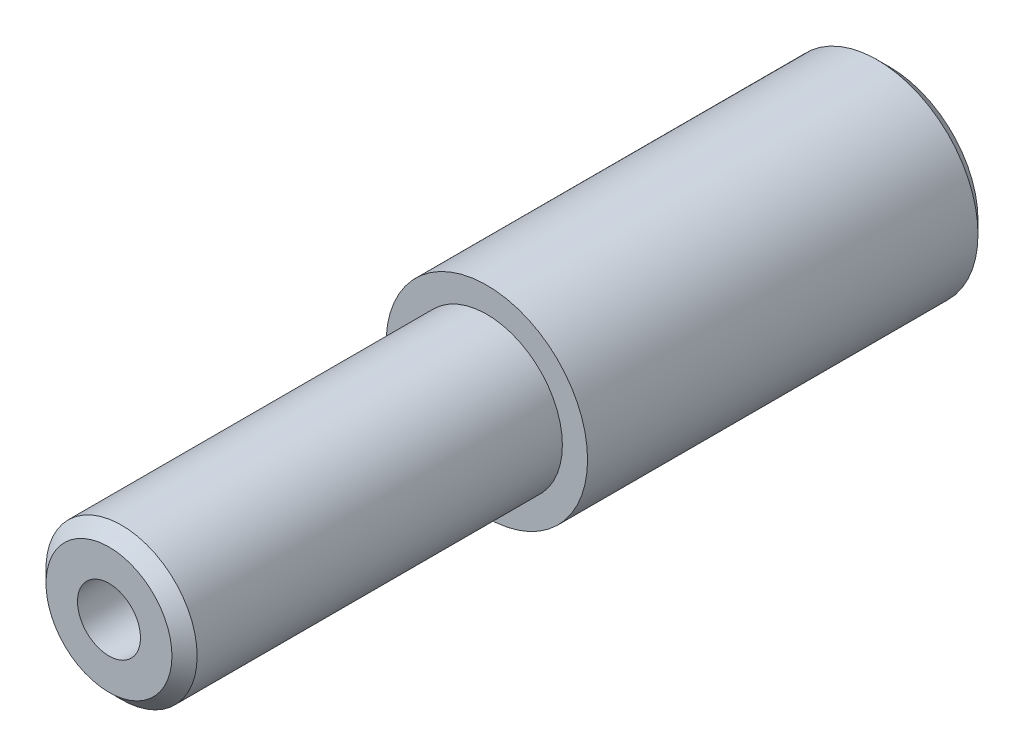
ISO-10303-21;
HEADER;
FILE_DESCRIPTION(('STEP AP214'),'2;1');
FILE_NAME('part.step','',(''),(''),'','','');
FILE_SCHEMA(('AUTOMOTIVE_DESIGN { 1 0 10303 214 1 1 1 1 }'));
ENDSEC;
DATA;
#1=APPLICATION_CONTEXT('core data for automotive mechanical design processes');
#2=APPLICATION_PROTOCOL_DEFINITION('international standard','automotive_design',2000,#1);
#3=PRODUCT_CONTEXT('',#1,'mechanical');
#4=PRODUCT('Part','Part','',(#3));
#5=PRODUCT_RELATED_PRODUCT_CATEGORY('part','',(#4));
#6=PRODUCT_DEFINITION_FORMATION('','',#4);
#7=PRODUCT_DEFINITION_CONTEXT('part definition',#1,'design');
#8=PRODUCT_DEFINITION('design','',#6,#7);
#9=PRODUCT_DEFINITION_SHAPE('','',#8);
#10=(LENGTH_UNIT() NAMED_UNIT(*) SI_UNIT(.MILLI.,.METRE.));
#11=(NAMED_UNIT(*) PLANE_ANGLE_UNIT() SI_UNIT($,.RADIAN.));
#12=(NAMED_UNIT(*) SI_UNIT($,.STERADIAN.) SOLID_ANGLE_UNIT());
#13=UNCERTAINTY_MEASURE_WITH_UNIT(LENGTH_MEASURE(1.E-05),#10,'distance_accuracy_value','');
#14=(GEOMETRIC_REPRESENTATION_CONTEXT(3) GLOBAL_UNCERTAINTY_ASSIGNED_CONTEXT((#13)) GLOBAL_UNIT_ASSIGNED_CONTEXT((#10,
#11,#12)) REPRESENTATION_CONTEXT('',''));
#15=CARTESIAN_POINT('',(0.,0.,0.));
#16=DIRECTION('',(0.,0.,1.));
#17=DIRECTION('',(1.,0.,0.));
#18=AXIS2_PLACEMENT_3D('',#15,#16,#17);
#19=CARTESIAN_POINT('',(-161.229707573776,-61.0733009045741,16.));
#20=DIRECTION('',(0.,0.,1.));
#21=DIRECTION('',(1.,0.,0.));
#22=AXIS2_PLACEMENT_3D('',#19,#20,#21);
#23=PLANE('',#22);
#24=CARTESIAN_POINT('',(-161.229707573776,-61.0733009045741,16.));
#25=DIRECTION('',(0.,0.,1.));
#26=DIRECTION('',(1.,0.,0.));
#27=AXIS2_PLACEMENT_3D('',#24,#25,#26);
#28=CIRCLE('',#27,3.99999999999999);
#29=CARTESIAN_POINT('',(-157.229707573776,-61.0733009045741,16.));
#30=VERTEX_POINT('',#29);
#31=EDGE_CURVE('E54',#30,#30,#28,.T.);
#32=ORIENTED_EDGE('',*,*,#31,.T.);
#33=EDGE_LOOP('',(#32));
#34=FACE_BOUND('',#33,.T.);
#35=CARTESIAN_POINT('',(-161.229707573776,-61.0733009045741,16.));
#36=DIRECTION('',(0.,0.,1.));
#37=DIRECTION('',(1.,0.,0.));
#38=AXIS2_PLACEMENT_3D('',#35,#36,#37);
#39=CIRCLE('',#38,2.99999999999999);
#40=CARTESIAN_POINT('',(-158.229707573776,-61.0733009045741,16.));
#41=VERTEX_POINT('',#40);
#42=EDGE_CURVE('E57',#41,#41,#39,.T.);
#43=ORIENTED_EDGE('',*,*,#42,.F.);
#44=EDGE_LOOP('',(#43));
#45=FACE_BOUND('',#44,.T.);
#46=ADVANCED_FACE('F34',(#34,#45),#23,.T.);
#47=CARTESIAN_POINT('',(-161.229707573776,-61.0733009045741,16.));
#48=DIRECTION('',(0.,0.,-1.));
#49=DIRECTION('',(-1.,0.,0.));
#50=AXIS2_PLACEMENT_3D('',#47,#48,#49);
#51=CYLINDRICAL_SURFACE('',#50,3.99999999999999);
#52=CARTESIAN_POINT('',(-161.229707573776,-61.0733009045741,0.49999999999998));
#53=DIRECTION('',(0.,0.,1.));
#54=DIRECTION('',(1.,0.,0.));
#55=AXIS2_PLACEMENT_3D('',#52,#53,#54);
#56=CIRCLE('',#55,3.99999999999999);
#57=CARTESIAN_POINT('',(-157.229707573776,-61.0733009045741,0.49999999999998));
#58=VERTEX_POINT('',#57);
#59=EDGE_CURVE('E49',#58,#58,#56,.T.);
#60=ORIENTED_EDGE('',*,*,#59,.T.);
#61=EDGE_LOOP('',(#60));
#62=FACE_BOUND('',#61,.T.);
#63=ORIENTED_EDGE('',*,*,#31,.F.);
#64=EDGE_LOOP('',(#63));
#65=FACE_BOUND('',#64,.T.);
#66=ADVANCED_FACE('F83',(#62,#65),#51,.T.);
#67=CARTESIAN_POINT('',(-161.229707573776,-61.0733009045741,0.));
#68=DIRECTION('',(0.,0.,1.));
#69=DIRECTION('',(1.,0.,0.));
#70=AXIS2_PLACEMENT_3D('',#67,#68,#69);
#71=PLANE('',#70);
#72=CARTESIAN_POINT('',(-161.229707573776,-61.0733009045741,0.));
#73=DIRECTION('',(0.,0.,1.));
#74=DIRECTION('',(1.,0.,0.));
#75=AXIS2_PLACEMENT_3D('',#72,#73,#74);
#76=CIRCLE('',#75,3.5);
#77=CARTESIAN_POINT('',(-157.729707573776,-61.0733009045741,0.));
#78=VERTEX_POINT('',#77);
#79=EDGE_CURVE('E45',#78,#78,#76,.F.);
#80=ORIENTED_EDGE('',*,*,#79,.T.);
#81=EDGE_LOOP('',(#80));
#82=FACE_BOUND('',#81,.T.);
#83=CARTESIAN_POINT('',(-161.229707573776,-61.0733009045741,0.));
#84=DIRECTION('',(0.,0.,1.));
#85=DIRECTION('',(1.,0.,0.));
#86=AXIS2_PLACEMENT_3D('',#83,#84,#85);
#87=CIRCLE('',#86,1.25000000000001);
#88=CARTESIAN_POINT('',(-159.979707573776,-61.0733009045741,0.));
#89=VERTEX_POINT('',#88);
#90=EDGE_CURVE('E60',#89,#89,#87,.T.);
#91=ORIENTED_EDGE('',*,*,#90,.T.);
#92=EDGE_LOOP('',(#91));
#93=FACE_BOUND('',#92,.T.);
#94=ADVANCED_FACE('F80',(#82,#93),#71,.F.);
#95=CARTESIAN_POINT('',(-161.229707573776,-61.0733009045741,31.));
#96=DIRECTION('',(0.,0.,-1.));
#97=DIRECTION('',(-1.,0.,0.));
#98=AXIS2_PLACEMENT_3D('',#95,#96,#97);
#99=CYLINDRICAL_SURFACE('',#98,2.99999999999999);
#100=CARTESIAN_POINT('',(-161.229707573776,-61.0733009045741,30.5));
#101=DIRECTION('',(0.,0.,1.));
#102=DIRECTION('',(1.,0.,0.));
#103=AXIS2_PLACEMENT_3D('',#100,#101,#102);
#104=CIRCLE('',#103,2.99999999999999);
#105=CARTESIAN_POINT('',(-158.229707573776,-61.0733009045741,30.5));
#106=VERTEX_POINT('',#105);
#107=EDGE_CURVE('E10',#106,#106,#104,.F.);
#108=ORIENTED_EDGE('',*,*,#107,.T.);
#109=EDGE_LOOP('',(#108));
#110=FACE_BOUND('',#109,.T.);
#111=ORIENTED_EDGE('',*,*,#42,.T.);
#112=EDGE_LOOP('',(#111));
#113=FACE_BOUND('',#112,.T.);
#114=ADVANCED_FACE('F72',(#110,#113),#99,.T.);
#115=CARTESIAN_POINT('',(-161.229707573776,-61.0733009045741,31.));
#116=DIRECTION('',(0.,0.,1.));
#117=DIRECTION('',(1.,0.,0.));
#118=AXIS2_PLACEMENT_3D('',#115,#116,#117);
#119=PLANE('',#118);
#120=CARTESIAN_POINT('',(-161.229707573776,-61.0733009045741,31.));
#121=DIRECTION('',(0.,0.,1.));
#122=DIRECTION('',(1.,0.,0.));
#123=AXIS2_PLACEMENT_3D('',#120,#121,#122);
#124=CIRCLE('',#123,2.5);
#125=CARTESIAN_POINT('',(-158.729707573776,-61.0733009045741,31.));
#126=VERTEX_POINT('',#125);
#127=EDGE_CURVE('E41',#126,#126,#124,.T.);
#128=ORIENTED_EDGE('',*,*,#127,.T.);
#129=EDGE_LOOP('',(#128));
#130=FACE_BOUND('',#129,.T.);
#131=CARTESIAN_POINT('',(-161.229707573776,-61.0733009045741,31.));
#132=DIRECTION('',(0.,0.,1.));
#133=DIRECTION('',(1.,0.,0.));
#134=AXIS2_PLACEMENT_3D('',#131,#132,#133);
#135=CIRCLE('',#134,1.25000000000001);
#136=CARTESIAN_POINT('',(-159.979707573776,-61.0733009045741,31.));
#137=VERTEX_POINT('',#136);
#138=EDGE_CURVE('E63',#137,#137,#135,.T.);
#139=ORIENTED_EDGE('',*,*,#138,.F.);
#140=EDGE_LOOP('',(#139));
#141=FACE_BOUND('',#140,.T.);
#142=ADVANCED_FACE('F70',(#130,#141),#119,.T.);
#143=CARTESIAN_POINT('',(-161.229707573776,-61.0733009045741,-9.));
#144=DIRECTION('',(0.,0.,1.));
#145=DIRECTION('',(1.,0.,0.));
#146=AXIS2_PLACEMENT_3D('',#143,#144,#145);
#147=CYLINDRICAL_SURFACE('',#146,1.25000000000001);
#148=ORIENTED_EDGE('',*,*,#138,.T.);
#149=EDGE_LOOP('',(#148));
#150=FACE_BOUND('',#149,.T.);
#151=ORIENTED_EDGE('',*,*,#90,.F.);
#152=EDGE_LOOP('',(#151));
#153=FACE_BOUND('',#152,.T.);
#154=ADVANCED_FACE('F67',(#150,#153),#147,.F.);
#155=CARTESIAN_POINT('',(-161.229707573776,-61.0733009045741,0.49999999999998));
#156=DIRECTION('',(0.,0.,1.));
#157=DIRECTION('',(1.,0.,0.));
#158=AXIS2_PLACEMENT_3D('',#155,#156,#157);
#159=CONICAL_SURFACE('',#158,3.99999999999999,0.785398163397459);
#160=ORIENTED_EDGE('',*,*,#79,.F.);
#161=EDGE_LOOP('',(#160));
#162=FACE_BOUND('',#161,.T.);
#163=ORIENTED_EDGE('',*,*,#59,.F.);
#164=EDGE_LOOP('',(#163));
#165=FACE_BOUND('',#164,.T.);
#166=ADVANCED_FACE('F78',(#162,#165),#159,.T.);
#167=CARTESIAN_POINT('',(-161.229707573776,-61.0733009045741,31.));
#168=DIRECTION('',(0.,0.,-1.));
#169=DIRECTION('',(-1.,0.,0.));
#170=AXIS2_PLACEMENT_3D('',#167,#168,#169);
#171=CONICAL_SURFACE('',#170,2.5,0.78539816339743);
#172=ORIENTED_EDGE('',*,*,#107,.F.);
#173=EDGE_LOOP('',(#172));
#174=FACE_BOUND('',#173,.T.);
#175=ORIENTED_EDGE('',*,*,#127,.F.);
#176=EDGE_LOOP('',(#175));
#177=FACE_BOUND('',#176,.T.);
#178=ADVANCED_FACE('F36',(#174,#177),#171,.T.);
#179=CLOSED_SHELL('',(#46,#66,#94,#114,#142,#154,#166,#178));
#180=MANIFOLD_SOLID_BREP('B2',#179);
#181=ADVANCED_BREP_SHAPE_REPRESENTATION('',(#18,#180),#14);
#182=SHAPE_DEFINITION_REPRESENTATION(#9,#181);
ENDSEC;
END-ISO-10303-21;
